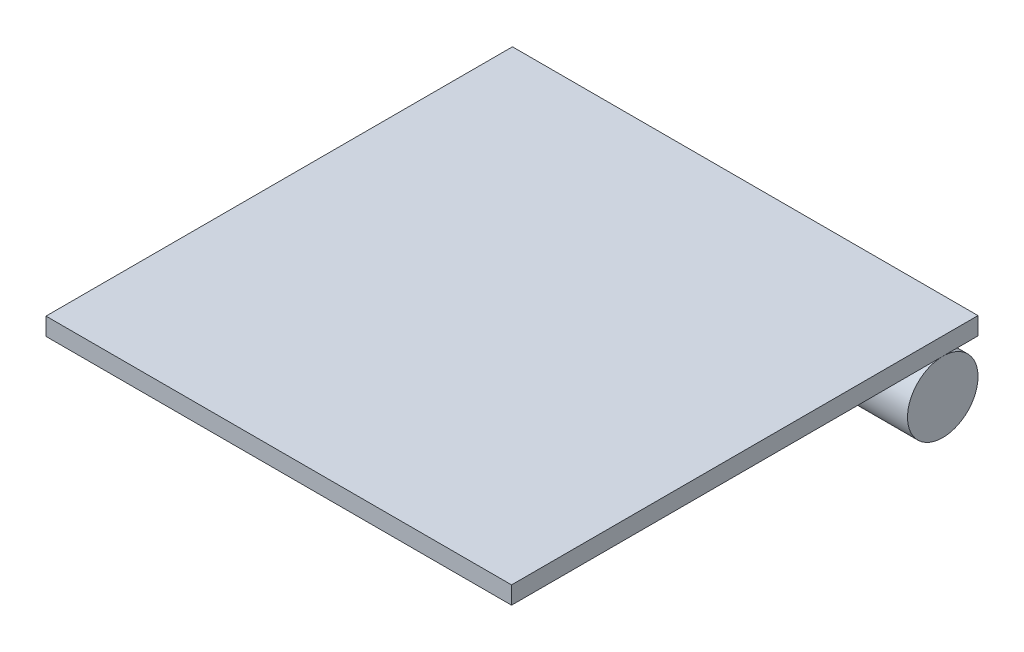
ISO-10303-21;
HEADER;
FILE_DESCRIPTION(('STEP AP214'),'2;1');
FILE_NAME('part.step','',(''),(''),'','','');
FILE_SCHEMA(('AUTOMOTIVE_DESIGN { 1 0 10303 214 1 1 1 1 }'));
ENDSEC;
DATA;
#1=APPLICATION_CONTEXT('core data for automotive mechanical design processes');
#2=APPLICATION_PROTOCOL_DEFINITION('international standard','automotive_design',2000,#1);
#3=PRODUCT_CONTEXT('',#1,'mechanical');
#4=PRODUCT('Part','Part','',(#3));
#5=PRODUCT_RELATED_PRODUCT_CATEGORY('part','',(#4));
#6=PRODUCT_DEFINITION_FORMATION('','',#4);
#7=PRODUCT_DEFINITION_CONTEXT('part definition',#1,'design');
#8=PRODUCT_DEFINITION('design','',#6,#7);
#9=PRODUCT_DEFINITION_SHAPE('','',#8);
#10=(LENGTH_UNIT() NAMED_UNIT(*) SI_UNIT(.MILLI.,.METRE.));
#11=(NAMED_UNIT(*) PLANE_ANGLE_UNIT() SI_UNIT($,.RADIAN.));
#12=(NAMED_UNIT(*) SI_UNIT($,.STERADIAN.) SOLID_ANGLE_UNIT());
#13=UNCERTAINTY_MEASURE_WITH_UNIT(LENGTH_MEASURE(1.E-05),#10,'distance_accuracy_value','');
#14=(GEOMETRIC_REPRESENTATION_CONTEXT(3) GLOBAL_UNCERTAINTY_ASSIGNED_CONTEXT((#13)) GLOBAL_UNIT_ASSIGNED_CONTEXT((#10,
#11,#12)) REPRESENTATION_CONTEXT('',''));
#15=CARTESIAN_POINT('',(0.,0.,0.));
#16=DIRECTION('',(0.,0.,1.));
#17=DIRECTION('',(1.,0.,0.));
#18=AXIS2_PLACEMENT_3D('',#15,#16,#17);
#19=CARTESIAN_POINT('',(132.08,-10.,-122.334));
#20=DIRECTION('',(-1.,0.,0.));
#21=DIRECTION('',(0.,0.,1.));
#22=AXIS2_PLACEMENT_3D('',#19,#20,#21);
#23=CYLINDRICAL_SURFACE('',#22,9.99999999999999);
#24=CARTESIAN_POINT('',(0.,-10.,-122.334));
#25=DIRECTION('',(1.,0.,0.));
#26=DIRECTION('',(0.,0.,-1.));
#27=AXIS2_PLACEMENT_3D('',#24,#25,#26);
#28=CIRCLE('',#27,9.99999999999999);
#29=CARTESIAN_POINT('',(0.,-10.,-132.334));
#30=VERTEX_POINT('',#29);
#31=EDGE_CURVE('E12',#30,#30,#28,.T.);
#32=ORIENTED_EDGE('',*,*,#31,.T.);
#33=EDGE_LOOP('',(#32));
#34=FACE_BOUND('',#33,.T.);
#35=CARTESIAN_POINT('',(132.08,-10.,-122.334));
#36=DIRECTION('',(1.,0.,0.));
#37=DIRECTION('',(0.,0.,-1.));
#38=AXIS2_PLACEMENT_3D('',#35,#36,#37);
#39=CIRCLE('',#38,9.99999999999999);
#40=CARTESIAN_POINT('',(132.08,-10.,-132.334));
#41=VERTEX_POINT('',#40);
#42=EDGE_CURVE('E62',#41,#41,#39,.T.);
#43=ORIENTED_EDGE('',*,*,#42,.F.);
#44=EDGE_LOOP('',(#43));
#45=FACE_BOUND('',#44,.T.);
#46=ADVANCED_FACE('F58',(#34,#45),#23,.T.);
#47=CARTESIAN_POINT('',(132.08,0.,0.));
#48=DIRECTION('',(1.,0.,0.));
#49=DIRECTION('',(0.,0.,-1.));
#50=AXIS2_PLACEMENT_3D('',#47,#48,#49);
#51=PLANE('',#50);
#52=ORIENTED_EDGE('',*,*,#42,.T.);
#53=EDGE_LOOP('',(#52));
#54=FACE_BOUND('',#53,.T.);
#55=ADVANCED_FACE('F60',(#54),#51,.T.);
#56=CARTESIAN_POINT('',(0.,0.,0.));
#57=DIRECTION('',(1.,0.,0.));
#58=DIRECTION('',(0.,0.,-1.));
#59=AXIS2_PLACEMENT_3D('',#56,#57,#58);
#60=PLANE('',#59);
#61=ORIENTED_EDGE('',*,*,#31,.F.);
#62=EDGE_LOOP('',(#61));
#63=FACE_BOUND('',#62,.T.);
#64=ADVANCED_FACE('F77',(#63),#60,.F.);
#65=CLOSED_SHELL('',(#46,#55,#64));
#66=MANIFOLD_SOLID_BREP('B2',#65);
#67=CARTESIAN_POINT('',(132.08,0.,0.));
#68=DIRECTION('',(0.,1.,0.));
#69=DIRECTION('',(0.,0.,1.));
#70=AXIS2_PLACEMENT_3D('',#67,#68,#69);
#71=PLANE('',#70);
#72=DIRECTION('',(-1.,0.,0.));
#73=VECTOR('',#72,1.);
#74=CARTESIAN_POINT('',(132.08,0.,-132.334));
#75=LINE('',#74,#73);
#76=CARTESIAN_POINT('',(132.08,0.,-132.334));
#77=VERTEX_POINT('',#76);
#78=CARTESIAN_POINT('',(0.,0.,-132.334));
#79=VERTEX_POINT('',#78);
#80=EDGE_CURVE('E159',#77,#79,#75,.T.);
#81=ORIENTED_EDGE('',*,*,#80,.F.);
#82=DIRECTION('',(0.,0.,-1.));
#83=VECTOR('',#82,1.);
#84=CARTESIAN_POINT('',(132.08,0.,0.));
#85=LINE('',#84,#83);
#86=CARTESIAN_POINT('',(132.08,0.,0.));
#87=VERTEX_POINT('',#86);
#88=EDGE_CURVE('E116',#87,#77,#85,.T.);
#89=ORIENTED_EDGE('',*,*,#88,.F.);
#90=DIRECTION('',(-1.,0.,0.));
#91=VECTOR('',#90,1.);
#92=CARTESIAN_POINT('',(132.08,0.,0.));
#93=LINE('',#92,#91);
#94=CARTESIAN_POINT('',(0.,0.,0.));
#95=VERTEX_POINT('',#94);
#96=EDGE_CURVE('E156',#87,#95,#93,.T.);
#97=ORIENTED_EDGE('',*,*,#96,.T.);
#98=DIRECTION('',(0.,0.,-1.));
#99=VECTOR('',#98,1.);
#100=CARTESIAN_POINT('',(0.,0.,0.));
#101=LINE('',#100,#99);
#102=EDGE_CURVE('E139',#95,#79,#101,.T.);
#103=ORIENTED_EDGE('',*,*,#102,.T.);
#104=EDGE_LOOP('',(#81,#89,#97,#103));
#105=FACE_BOUND('',#104,.T.);
#106=ADVANCED_FACE('F99',(#105),#71,.F.);
#107=CARTESIAN_POINT('',(132.08,0.,-132.334));
#108=DIRECTION('',(0.,0.,1.));
#109=DIRECTION('',(1.,0.,0.));
#110=AXIS2_PLACEMENT_3D('',#107,#108,#109);
#111=PLANE('',#110);
#112=DIRECTION('',(0.,1.,0.));
#113=VECTOR('',#112,1.);
#114=CARTESIAN_POINT('',(0.,0.,-132.334));
#115=LINE('',#114,#113);
#116=CARTESIAN_POINT('',(0.,5.,-132.334));
#117=VERTEX_POINT('',#116);
#118=EDGE_CURVE('E163',#79,#117,#115,.T.);
#119=ORIENTED_EDGE('',*,*,#118,.T.);
#120=DIRECTION('',(-1.,0.,0.));
#121=VECTOR('',#120,1.);
#122=CARTESIAN_POINT('',(132.08,5.,-132.334));
#123=LINE('',#122,#121);
#124=CARTESIAN_POINT('',(132.08,5.,-132.334));
#125=VERTEX_POINT('',#124);
#126=EDGE_CURVE('E56',#125,#117,#123,.T.);
#127=ORIENTED_EDGE('',*,*,#126,.F.);
#128=DIRECTION('',(0.,1.,0.));
#129=VECTOR('',#128,1.);
#130=CARTESIAN_POINT('',(132.08,0.,-132.334));
#131=LINE('',#130,#129);
#132=EDGE_CURVE('E151',#77,#125,#131,.T.);
#133=ORIENTED_EDGE('',*,*,#132,.F.);
#134=ORIENTED_EDGE('',*,*,#80,.T.);
#135=EDGE_LOOP('',(#119,#127,#133,#134));
#136=FACE_BOUND('',#135,.T.);
#137=ADVANCED_FACE('F101',(#136),#111,.F.);
#138=CARTESIAN_POINT('',(132.08,5.,-132.334));
#139=DIRECTION('',(0.,-1.,0.));
#140=DIRECTION('',(0.,0.,-1.));
#141=AXIS2_PLACEMENT_3D('',#138,#139,#140);
#142=PLANE('',#141);
#143=DIRECTION('',(0.,0.,1.));
#144=VECTOR('',#143,1.);
#145=CARTESIAN_POINT('',(0.,5.,-132.334));
#146=LINE('',#145,#144);
#147=CARTESIAN_POINT('',(0.,5.,0.));
#148=VERTEX_POINT('',#147);
#149=EDGE_CURVE('E155',#117,#148,#146,.T.);
#150=ORIENTED_EDGE('',*,*,#149,.T.);
#151=DIRECTION('',(-1.,0.,0.));
#152=VECTOR('',#151,1.);
#153=CARTESIAN_POINT('',(132.08,5.,0.));
#154=LINE('',#153,#152);
#155=CARTESIAN_POINT('',(132.08,5.,0.));
#156=VERTEX_POINT('',#155);
#157=EDGE_CURVE('E108',#156,#148,#154,.T.);
#158=ORIENTED_EDGE('',*,*,#157,.F.);
#159=DIRECTION('',(0.,0.,1.));
#160=VECTOR('',#159,1.);
#161=CARTESIAN_POINT('',(132.08,5.,-132.334));
#162=LINE('',#161,#160);
#163=EDGE_CURVE('E146',#125,#156,#162,.T.);
#164=ORIENTED_EDGE('',*,*,#163,.F.);
#165=ORIENTED_EDGE('',*,*,#126,.T.);
#166=EDGE_LOOP('',(#150,#158,#164,#165));
#167=FACE_BOUND('',#166,.T.);
#168=ADVANCED_FACE('F154',(#167),#142,.F.);
#169=CARTESIAN_POINT('',(132.08,5.,0.));
#170=DIRECTION('',(0.,0.,-1.));
#171=DIRECTION('',(-1.,0.,0.));
#172=AXIS2_PLACEMENT_3D('',#169,#170,#171);
#173=PLANE('',#172);
#174=DIRECTION('',(0.,-1.,0.));
#175=VECTOR('',#174,1.);
#176=CARTESIAN_POINT('',(0.,5.,0.));
#177=LINE('',#176,#175);
#178=EDGE_CURVE('E133',#148,#95,#177,.T.);
#179=ORIENTED_EDGE('',*,*,#178,.T.);
#180=ORIENTED_EDGE('',*,*,#96,.F.);
#181=DIRECTION('',(0.,-1.,0.));
#182=VECTOR('',#181,1.);
#183=CARTESIAN_POINT('',(132.08,5.,0.));
#184=LINE('',#183,#182);
#185=EDGE_CURVE('E149',#156,#87,#184,.T.);
#186=ORIENTED_EDGE('',*,*,#185,.F.);
#187=ORIENTED_EDGE('',*,*,#157,.T.);
#188=EDGE_LOOP('',(#179,#180,#186,#187));
#189=FACE_BOUND('',#188,.T.);
#190=ADVANCED_FACE('F157',(#189),#173,.F.);
#191=CARTESIAN_POINT('',(132.08,0.,0.));
#192=DIRECTION('',(1.,0.,0.));
#193=DIRECTION('',(0.,0.,-1.));
#194=AXIS2_PLACEMENT_3D('',#191,#192,#193);
#195=PLANE('',#194);
#196=ORIENTED_EDGE('',*,*,#132,.T.);
#197=ORIENTED_EDGE('',*,*,#163,.T.);
#198=ORIENTED_EDGE('',*,*,#185,.T.);
#199=ORIENTED_EDGE('',*,*,#88,.T.);
#200=EDGE_LOOP('',(#196,#197,#198,#199));
#201=FACE_BOUND('',#200,.T.);
#202=ADVANCED_FACE('F147',(#201),#195,.T.);
#203=CARTESIAN_POINT('',(0.,0.,0.));
#204=DIRECTION('',(1.,0.,0.));
#205=DIRECTION('',(0.,0.,-1.));
#206=AXIS2_PLACEMENT_3D('',#203,#204,#205);
#207=PLANE('',#206);
#208=ORIENTED_EDGE('',*,*,#118,.F.);
#209=ORIENTED_EDGE('',*,*,#102,.F.);
#210=ORIENTED_EDGE('',*,*,#178,.F.);
#211=ORIENTED_EDGE('',*,*,#149,.F.);
#212=EDGE_LOOP('',(#208,#209,#210,#211));
#213=FACE_BOUND('',#212,.T.);
#214=ADVANCED_FACE('F172',(#213),#207,.F.);
#215=CLOSED_SHELL('',(#106,#137,#168,#190,#202,#214));
#216=MANIFOLD_SOLID_BREP('B7',#215);
#217=ADVANCED_BREP_SHAPE_REPRESENTATION('',(#18,#66,#216),#14);
#218=SHAPE_DEFINITION_REPRESENTATION(#9,#217);
ENDSEC;
END-ISO-10303-21;
